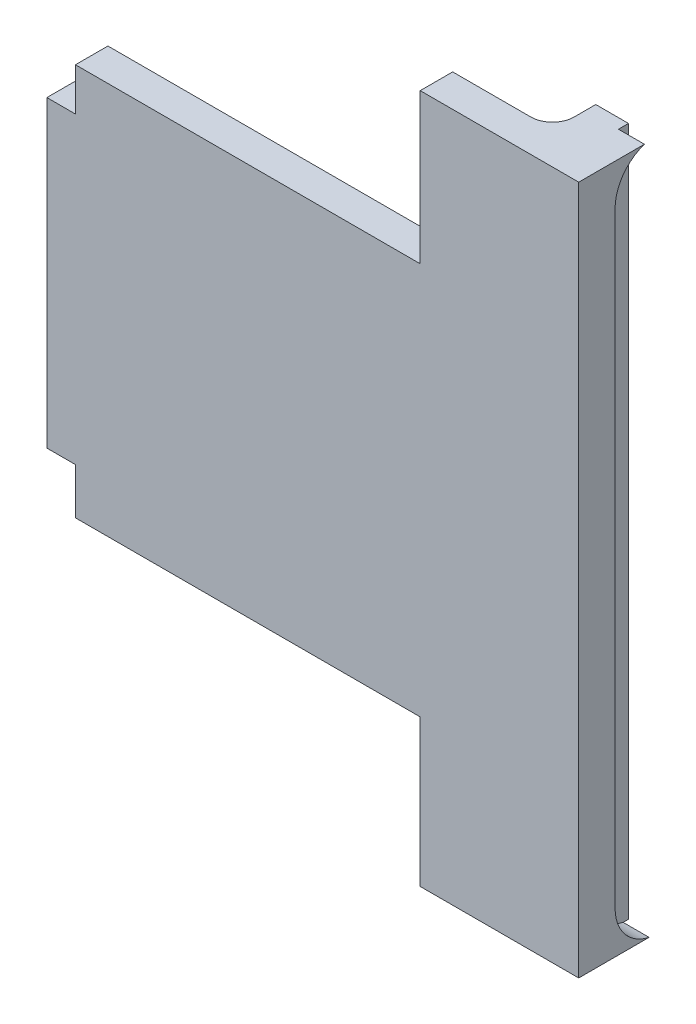
ISO-10303-21;
HEADER;
FILE_DESCRIPTION(('STEP AP214'),'2;1');
FILE_NAME('part.step','',(''),(''),'','','');
FILE_SCHEMA(('AUTOMOTIVE_DESIGN { 1 0 10303 214 1 1 1 1 }'));
ENDSEC;
DATA;
#1=APPLICATION_CONTEXT('core data for automotive mechanical design processes');
#2=APPLICATION_PROTOCOL_DEFINITION('international standard','automotive_design',2000,#1);
#3=PRODUCT_CONTEXT('',#1,'mechanical');
#4=PRODUCT('Part','Part','',(#3));
#5=PRODUCT_RELATED_PRODUCT_CATEGORY('part','',(#4));
#6=PRODUCT_DEFINITION_FORMATION('','',#4);
#7=PRODUCT_DEFINITION_CONTEXT('part definition',#1,'design');
#8=PRODUCT_DEFINITION('design','',#6,#7);
#9=PRODUCT_DEFINITION_SHAPE('','',#8);
#10=(LENGTH_UNIT() NAMED_UNIT(*) SI_UNIT(.MILLI.,.METRE.));
#11=(NAMED_UNIT(*) PLANE_ANGLE_UNIT() SI_UNIT($,.RADIAN.));
#12=(NAMED_UNIT(*) SI_UNIT($,.STERADIAN.) SOLID_ANGLE_UNIT());
#13=UNCERTAINTY_MEASURE_WITH_UNIT(LENGTH_MEASURE(1.E-05),#10,'distance_accuracy_value','');
#14=(GEOMETRIC_REPRESENTATION_CONTEXT(3) GLOBAL_UNCERTAINTY_ASSIGNED_CONTEXT((#13)) GLOBAL_UNIT_ASSIGNED_CONTEXT((#10,
#11,#12)) REPRESENTATION_CONTEXT('',''));
#15=CARTESIAN_POINT('',(0.,0.,0.));
#16=DIRECTION('',(0.,0.,1.));
#17=DIRECTION('',(1.,0.,0.));
#18=AXIS2_PLACEMENT_3D('',#15,#16,#17);
#19=CARTESIAN_POINT('',(0.,0.,-3.5));
#20=DIRECTION('',(0.,0.,-1.));
#21=DIRECTION('',(-1.,0.,0.));
#22=AXIS2_PLACEMENT_3D('',#19,#20,#21);
#23=PLANE('',#22);
#24=DIRECTION('',(1.,0.,0.));
#25=VECTOR('',#24,1.);
#26=CARTESIAN_POINT('',(20.475117675781,24.5546886573642,-3.5));
#27=LINE('',#26,#25);
#28=CARTESIAN_POINT('',(17.7615783203655,24.5546886573642,-3.5));
#29=VERTEX_POINT('',#28);
#30=CARTESIAN_POINT('',(19.275117675781,24.5546886573642,-3.5));
#31=VERTEX_POINT('',#30);
#32=EDGE_CURVE('E273',#29,#31,#27,.T.);
#33=ORIENTED_EDGE('',*,*,#32,.T.);
#34=DIRECTION('',(0.,-1.,0.));
#35=VECTOR('',#34,1.);
#36=CARTESIAN_POINT('',(19.275117675781,0.,-3.5));
#37=LINE('',#36,#35);
#38=CARTESIAN_POINT('',(19.275117675781,-7.29255430174192,-3.5));
#39=VERTEX_POINT('',#38);
#40=EDGE_CURVE('E393',#31,#39,#37,.T.);
#41=ORIENTED_EDGE('',*,*,#40,.T.);
#42=DIRECTION('',(-1.,0.,0.));
#43=VECTOR('',#42,1.);
#44=CARTESIAN_POINT('',(20.475117675781,-7.29255430174192,-3.5));
#45=LINE('',#44,#43);
#46=CARTESIAN_POINT('',(17.7615783203655,-7.29255430174192,-3.5));
#47=VERTEX_POINT('',#46);
#48=EDGE_CURVE('E261',#39,#47,#45,.T.);
#49=ORIENTED_EDGE('',*,*,#48,.T.);
#50=DIRECTION('',(0.,1.,0.));
#51=VECTOR('',#50,1.);
#52=CARTESIAN_POINT('',(17.7615783203655,24.5546886573642,-3.5));
#53=LINE('',#52,#51);
#54=EDGE_CURVE('E271',#47,#29,#53,.T.);
#55=ORIENTED_EDGE('',*,*,#54,.T.);
#56=EDGE_LOOP('',(#33,#41,#49,#55));
#57=FACE_BOUND('',#56,.T.);
#58=ADVANCED_FACE('F39',(#57),#23,.T.);
#59=CARTESIAN_POINT('',(20.475117675781,24.5546886573642,-1.5));
#60=DIRECTION('',(1.,0.,0.));
#61=DIRECTION('',(0.,0.,-1.));
#62=AXIS2_PLACEMENT_3D('',#59,#60,#61);
#63=PLANE('',#62);
#64=CARTESIAN_POINT('',(20.475117675781,22.661301397595,-3.67942817224289));
#65=DIRECTION('',(1.,0.,0.));
#66=DIRECTION('',(0.,0.,-1.));
#67=AXIS2_PLACEMENT_3D('',#64,#65,#66);
#68=CIRCLE('',#67,2.);
#69=CARTESIAN_POINT('',(20.475117675781,24.5546886573642,-3.03515751130633));
#70=VERTEX_POINT('',#69);
#71=CARTESIAN_POINT('',(20.475117675781,22.6613013101723,-1.67942817224289));
#72=VERTEX_POINT('',#71);
#73=EDGE_CURVE('E221',#70,#72,#68,.T.);
#74=ORIENTED_EDGE('',*,*,#73,.F.);
#75=DIRECTION('',(0.,0.,1.));
#76=VECTOR('',#75,1.);
#77=CARTESIAN_POINT('',(20.475117675781,24.5546886573642,-1.5));
#78=LINE('',#77,#76);
#79=CARTESIAN_POINT('',(20.475117675781,24.5546886573642,0.));
#80=VERTEX_POINT('',#79);
#81=EDGE_CURVE('E306',#70,#80,#78,.T.);
#82=ORIENTED_EDGE('',*,*,#81,.T.);
#83=DIRECTION('',(0.,1.,0.));
#84=VECTOR('',#83,1.);
#85=CARTESIAN_POINT('',(20.475117675781,24.5546886573642,0.));
#86=LINE('',#85,#84);
#87=CARTESIAN_POINT('',(20.475117675781,-7.29255430174192,0.));
#88=VERTEX_POINT('',#87);
#89=EDGE_CURVE('E282',#88,#80,#86,.T.);
#90=ORIENTED_EDGE('',*,*,#89,.F.);
#91=DIRECTION('',(0.,0.,1.));
#92=VECTOR('',#91,1.);
#93=CARTESIAN_POINT('',(20.475117675781,-7.29255430174192,-1.5));
#94=LINE('',#93,#92);
#95=CARTESIAN_POINT('',(20.475117675781,-7.29255430174192,-3.25229018446545));
#96=VERTEX_POINT('',#95);
#97=EDGE_CURVE('E341',#96,#88,#94,.T.);
#98=ORIENTED_EDGE('',*,*,#97,.F.);
#99=CARTESIAN_POINT('',(20.475117675781,-5.338698602405,-3.67942939616189));
#100=DIRECTION('',(1.,0.,0.));
#101=DIRECTION('',(0.,0.,-1.));
#102=AXIS2_PLACEMENT_3D('',#99,#100,#101);
#103=CIRCLE('',#102,2.);
#104=CARTESIAN_POINT('',(20.475117675781,-5.3386986898277,-1.6794293961619));
#105=VERTEX_POINT('',#104);
#106=EDGE_CURVE('E215',#105,#96,#103,.T.);
#107=ORIENTED_EDGE('',*,*,#106,.F.);
#108=DIRECTION('',(0.,-0.999999999999999,-4.37113928572386E-08));
#109=VECTOR('',#108,1.);
#110=CARTESIAN_POINT('',(20.475117675781,22.6613013101723,-1.67942817224289));
#111=LINE('',#110,#109);
#112=EDGE_CURVE('E234',#72,#105,#111,.T.);
#113=ORIENTED_EDGE('',*,*,#112,.F.);
#114=EDGE_LOOP('',(#74,#82,#90,#98,#107,#113));
#115=FACE_BOUND('',#114,.T.);
#116=ADVANCED_FACE('F401',(#115),#63,.T.);
#117=CARTESIAN_POINT('',(20.475117675781,-7.29255430174192,-1.5));
#118=DIRECTION('',(0.,-1.,0.));
#119=DIRECTION('',(0.,0.,-1.));
#120=AXIS2_PLACEMENT_3D('',#117,#118,#119);
#121=PLANE('',#120);
#122=DIRECTION('',(1.,0.,0.));
#123=VECTOR('',#122,1.);
#124=CARTESIAN_POINT('',(19.275117675781,-7.29255430174192,-3.25229018446545));
#125=LINE('',#124,#123);
#126=CARTESIAN_POINT('',(19.275117675781,-7.29255430174192,-3.25229018446545));
#127=VERTEX_POINT('',#126);
#128=EDGE_CURVE('E11',#96,#127,#125,.F.);
#129=ORIENTED_EDGE('',*,*,#128,.F.);
#130=ORIENTED_EDGE('',*,*,#97,.T.);
#131=DIRECTION('',(1.,0.,0.));
#132=VECTOR('',#131,1.);
#133=CARTESIAN_POINT('',(20.475117675781,-7.29255430174192,0.));
#134=LINE('',#133,#132);
#135=CARTESIAN_POINT('',(13.1507220749256,-7.29255430174192,0.));
#136=VERTEX_POINT('',#135);
#137=EDGE_CURVE('E286',#136,#88,#134,.T.);
#138=ORIENTED_EDGE('',*,*,#137,.F.);
#139=DIRECTION('',(0.,0.,1.));
#140=VECTOR('',#139,1.);
#141=CARTESIAN_POINT('',(13.1507220749256,-7.29255430174192,-1.5));
#142=LINE('',#141,#140);
#143=CARTESIAN_POINT('',(13.1507220749256,-7.29255430174192,-1.5));
#144=VERTEX_POINT('',#143);
#145=EDGE_CURVE('E344',#144,#136,#142,.T.);
#146=ORIENTED_EDGE('',*,*,#145,.F.);
#147=DIRECTION('',(1.,0.,0.));
#148=VECTOR('',#147,1.);
#149=CARTESIAN_POINT('',(20.475117675781,-7.29255430174192,-1.5));
#150=LINE('',#149,#148);
#151=CARTESIAN_POINT('',(16.7615783203655,-7.29255430174192,-1.5));
#152=VERTEX_POINT('',#151);
#153=EDGE_CURVE('E303',#144,#152,#150,.T.);
#154=ORIENTED_EDGE('',*,*,#153,.T.);
#155=CARTESIAN_POINT('',(16.7615783203655,-7.29255430174192,-2.5));
#156=DIRECTION('',(0.,-1.,0.));
#157=DIRECTION('',(0.,0.,-1.));
#158=AXIS2_PLACEMENT_3D('',#155,#156,#157);
#159=CIRCLE('',#158,1.);
#160=CARTESIAN_POINT('',(17.7615783203655,-7.29255430174192,-2.5));
#161=VERTEX_POINT('',#160);
#162=EDGE_CURVE('E371',#152,#161,#159,.F.);
#163=ORIENTED_EDGE('',*,*,#162,.T.);
#164=DIRECTION('',(0.,0.,1.));
#165=VECTOR('',#164,1.);
#166=CARTESIAN_POINT('',(17.7615783203655,-7.29255430174192,-3.5));
#167=LINE('',#166,#165);
#168=EDGE_CURVE('E279',#47,#161,#167,.T.);
#169=ORIENTED_EDGE('',*,*,#168,.F.);
#170=ORIENTED_EDGE('',*,*,#48,.F.);
#171=DIRECTION('',(0.,0.,1.));
#172=VECTOR('',#171,1.);
#173=CARTESIAN_POINT('',(19.275117675781,-7.29255430174192,-1.5));
#174=LINE('',#173,#172);
#175=EDGE_CURVE('E54',#39,#127,#174,.T.);
#176=ORIENTED_EDGE('',*,*,#175,.T.);
#177=EDGE_LOOP('',(#129,#130,#138,#146,#154,#163,#169,#170,#176));
#178=FACE_BOUND('',#177,.T.);
#179=ADVANCED_FACE('F414',(#178),#121,.T.);
#180=CARTESIAN_POINT('',(13.1507220749256,-0.506964629242378,-1.5));
#181=DIRECTION('',(-1.,0.,0.));
#182=DIRECTION('',(0.,0.,1.));
#183=AXIS2_PLACEMENT_3D('',#180,#181,#182);
#184=PLANE('',#183);
#185=DIRECTION('',(0.,-1.,0.));
#186=VECTOR('',#185,1.);
#187=CARTESIAN_POINT('',(13.1507220749256,-0.506964629242378,0.));
#188=LINE('',#187,#186);
#189=CARTESIAN_POINT('',(13.1507220749256,-0.506964629242378,0.));
#190=VERTEX_POINT('',#189);
#191=EDGE_CURVE('E336',#190,#136,#188,.T.);
#192=ORIENTED_EDGE('',*,*,#191,.F.);
#193=DIRECTION('',(0.,0.,1.));
#194=VECTOR('',#193,1.);
#195=CARTESIAN_POINT('',(13.1507220749256,-0.506964629242378,-1.5));
#196=LINE('',#195,#194);
#197=CARTESIAN_POINT('',(13.1507220749256,-0.506964629242378,-1.5));
#198=VERTEX_POINT('',#197);
#199=EDGE_CURVE('E346',#198,#190,#196,.T.);
#200=ORIENTED_EDGE('',*,*,#199,.F.);
#201=DIRECTION('',(0.,-1.,0.));
#202=VECTOR('',#201,1.);
#203=CARTESIAN_POINT('',(13.1507220749256,-0.506964629242378,-1.5));
#204=LINE('',#203,#202);
#205=EDGE_CURVE('E300',#198,#144,#204,.T.);
#206=ORIENTED_EDGE('',*,*,#205,.T.);
#207=ORIENTED_EDGE('',*,*,#145,.T.);
#208=EDGE_LOOP('',(#192,#200,#206,#207));
#209=FACE_BOUND('',#208,.T.);
#210=ADVANCED_FACE('F453',(#209),#184,.T.);
#211=CARTESIAN_POINT('',(-2.77955076449114,-0.506964629242378,-1.5));
#212=DIRECTION('',(0.,-1.,0.));
#213=DIRECTION('',(0.,0.,-1.));
#214=AXIS2_PLACEMENT_3D('',#211,#212,#213);
#215=PLANE('',#214);
#216=DIRECTION('',(1.,0.,0.));
#217=VECTOR('',#216,1.);
#218=CARTESIAN_POINT('',(-2.77955076449114,-0.506964629242378,0.));
#219=LINE('',#218,#217);
#220=CARTESIAN_POINT('',(-2.77955076449114,-0.506964629242378,0.));
#221=VERTEX_POINT('',#220);
#222=EDGE_CURVE('E333',#221,#190,#219,.T.);
#223=ORIENTED_EDGE('',*,*,#222,.F.);
#224=DIRECTION('',(0.,0.,1.));
#225=VECTOR('',#224,1.);
#226=CARTESIAN_POINT('',(-2.77955076449114,-0.506964629242378,-1.5));
#227=LINE('',#226,#225);
#228=CARTESIAN_POINT('',(-2.77955076449114,-0.506964629242378,-1.5));
#229=VERTEX_POINT('',#228);
#230=EDGE_CURVE('E348',#229,#221,#227,.T.);
#231=ORIENTED_EDGE('',*,*,#230,.F.);
#232=DIRECTION('',(1.,0.,0.));
#233=VECTOR('',#232,1.);
#234=CARTESIAN_POINT('',(-2.77955076449114,-0.506964629242378,-1.5));
#235=LINE('',#234,#233);
#236=EDGE_CURVE('E297',#229,#198,#235,.T.);
#237=ORIENTED_EDGE('',*,*,#236,.T.);
#238=ORIENTED_EDGE('',*,*,#199,.T.);
#239=EDGE_LOOP('',(#223,#231,#237,#238));
#240=FACE_BOUND('',#239,.T.);
#241=ADVANCED_FACE('F456',(#240),#215,.T.);
#242=CARTESIAN_POINT('',(-2.77955076449114,1.62388622505816,-1.5));
#243=DIRECTION('',(-1.,0.,0.));
#244=DIRECTION('',(0.,0.,1.));
#245=AXIS2_PLACEMENT_3D('',#242,#243,#244);
#246=PLANE('',#245);
#247=DIRECTION('',(0.,0.,-1.));
#248=VECTOR('',#247,1.);
#249=CARTESIAN_POINT('',(-2.77955076449114,1.6490004139218,-0.75));
#250=LINE('',#249,#248);
#251=CARTESIAN_POINT('',(-2.77955076449114,1.6490004139218,-0.75));
#252=VERTEX_POINT('',#251);
#253=CARTESIAN_POINT('',(-2.77955076449114,1.6490004139218,-1.2));
#254=VERTEX_POINT('',#253);
#255=EDGE_CURVE('E262',#252,#254,#250,.T.);
#256=ORIENTED_EDGE('',*,*,#255,.T.);
#257=CARTESIAN_POINT('',(-2.77955076449114,1.3490004139218,-1.2));
#258=DIRECTION('',(-1.,0.,0.));
#259=DIRECTION('',(0.,0.,1.));
#260=AXIS2_PLACEMENT_3D('',#257,#258,#259);
#261=CIRCLE('',#260,0.3);
#262=CARTESIAN_POINT('',(-2.77955076449114,1.3490004139218,-1.5));
#263=VERTEX_POINT('',#262);
#264=EDGE_CURVE('E376',#254,#263,#261,.T.);
#265=ORIENTED_EDGE('',*,*,#264,.T.);
#266=DIRECTION('',(0.,-1.,0.));
#267=VECTOR('',#266,1.);
#268=CARTESIAN_POINT('',(-2.77955076449114,1.62388622505816,-1.5));
#269=LINE('',#268,#267);
#270=EDGE_CURVE('E295',#263,#229,#269,.T.);
#271=ORIENTED_EDGE('',*,*,#270,.T.);
#272=ORIENTED_EDGE('',*,*,#230,.T.);
#273=DIRECTION('',(0.,-1.,0.));
#274=VECTOR('',#273,1.);
#275=CARTESIAN_POINT('',(-2.77955076449114,1.62388622505816,0.));
#276=LINE('',#275,#274);
#277=CARTESIAN_POINT('',(-2.77955076449114,1.62388622505816,0.));
#278=VERTEX_POINT('',#277);
#279=EDGE_CURVE('E330',#278,#221,#276,.T.);
#280=ORIENTED_EDGE('',*,*,#279,.F.);
#281=DIRECTION('',(0.,0.,1.));
#282=VECTOR('',#281,1.);
#283=CARTESIAN_POINT('',(-2.77955076449114,1.62388622505816,-1.5));
#284=LINE('',#283,#282);
#285=CARTESIAN_POINT('',(-2.77955076449114,1.62388622505816,-0.75));
#286=VERTEX_POINT('',#285);
#287=EDGE_CURVE('E350',#286,#278,#284,.T.);
#288=ORIENTED_EDGE('',*,*,#287,.F.);
#289=DIRECTION('',(0.,-1.,0.));
#290=VECTOR('',#289,1.);
#291=CARTESIAN_POINT('',(-2.77955076449114,1.6490004139218,-0.75));
#292=LINE('',#291,#290);
#293=EDGE_CURVE('E250',#252,#286,#292,.T.);
#294=ORIENTED_EDGE('',*,*,#293,.F.);
#295=EDGE_LOOP('',(#256,#265,#271,#272,#280,#288,#294));
#296=FACE_BOUND('',#295,.T.);
#297=ADVANCED_FACE('F460',(#296),#246,.T.);
#298=CARTESIAN_POINT('',(-4.099999879847,1.62388622505816,-1.5));
#299=DIRECTION('',(0.,-1.,0.));
#300=DIRECTION('',(0.,0.,-1.));
#301=AXIS2_PLACEMENT_3D('',#298,#299,#300);
#302=PLANE('',#301);
#303=DIRECTION('',(-1.,0.,0.));
#304=VECTOR('',#303,1.);
#305=CARTESIAN_POINT('',(-2.77955076449114,1.62388622505816,-0.75));
#306=LINE('',#305,#304);
#307=CARTESIAN_POINT('',(-4.099999879847,1.62388622505816,-0.75));
#308=VERTEX_POINT('',#307);
#309=EDGE_CURVE('E252',#286,#308,#306,.T.);
#310=ORIENTED_EDGE('',*,*,#309,.F.);
#311=ORIENTED_EDGE('',*,*,#287,.T.);
#312=DIRECTION('',(1.,0.,0.));
#313=VECTOR('',#312,1.);
#314=CARTESIAN_POINT('',(-4.099999879847,1.62388622505816,0.));
#315=LINE('',#314,#313);
#316=CARTESIAN_POINT('',(-4.099999879847,1.62388622505816,0.));
#317=VERTEX_POINT('',#316);
#318=EDGE_CURVE('E327',#317,#278,#315,.T.);
#319=ORIENTED_EDGE('',*,*,#318,.F.);
#320=DIRECTION('',(0.,0.,1.));
#321=VECTOR('',#320,1.);
#322=CARTESIAN_POINT('',(-4.099999879847,1.62388622505816,-1.5));
#323=LINE('',#322,#321);
#324=EDGE_CURVE('E352',#308,#317,#323,.T.);
#325=ORIENTED_EDGE('',*,*,#324,.F.);
#326=EDGE_LOOP('',(#310,#311,#319,#325));
#327=FACE_BOUND('',#326,.T.);
#328=ADVANCED_FACE('F464',(#327),#302,.T.);
#329=CARTESIAN_POINT('',(-4.099999879847,15.6524412766217,-1.5));
#330=DIRECTION('',(-1.,0.,0.));
#331=DIRECTION('',(0.,0.,1.));
#332=AXIS2_PLACEMENT_3D('',#329,#330,#331);
#333=PLANE('',#332);
#334=DIRECTION('',(0.,0.,1.));
#335=VECTOR('',#334,1.);
#336=CARTESIAN_POINT('',(-4.099999879847,15.6524412766217,-1.5));
#337=LINE('',#336,#335);
#338=CARTESIAN_POINT('',(-4.099999879847,15.6524412766217,-1.38424038396934));
#339=VERTEX_POINT('',#338);
#340=CARTESIAN_POINT('',(-4.099999879847,15.6524412766217,0.));
#341=VERTEX_POINT('',#340);
#342=EDGE_CURVE('E354',#339,#341,#337,.T.);
#343=ORIENTED_EDGE('',*,*,#342,.F.);
#344=CARTESIAN_POINT('',(-4.099999879847,15.8892016637536,-1.2));
#345=DIRECTION('',(-1.,0.,0.));
#346=DIRECTION('',(0.,0.,1.));
#347=AXIS2_PLACEMENT_3D('',#344,#345,#346);
#348=CIRCLE('',#347,0.3);
#349=CARTESIAN_POINT('',(-4.099999879847,15.5892016637535,-1.2));
#350=VERTEX_POINT('',#349);
#351=EDGE_CURVE('E391',#339,#350,#348,.T.);
#352=ORIENTED_EDGE('',*,*,#351,.T.);
#353=DIRECTION('',(0.,0.,-1.));
#354=VECTOR('',#353,1.);
#355=CARTESIAN_POINT('',(-4.099999879847,15.5892016637535,-0.75));
#356=LINE('',#355,#354);
#357=CARTESIAN_POINT('',(-4.099999879847,15.5892016637535,-0.75));
#358=VERTEX_POINT('',#357);
#359=EDGE_CURVE('E258',#358,#350,#356,.T.);
#360=ORIENTED_EDGE('',*,*,#359,.F.);
#361=DIRECTION('',(0.,1.,0.));
#362=VECTOR('',#361,1.);
#363=CARTESIAN_POINT('',(-4.099999879847,15.5892016637535,-0.75));
#364=LINE('',#363,#362);
#365=EDGE_CURVE('E254',#308,#358,#364,.T.);
#366=ORIENTED_EDGE('',*,*,#365,.F.);
#367=ORIENTED_EDGE('',*,*,#324,.T.);
#368=DIRECTION('',(0.,-1.,0.));
#369=VECTOR('',#368,1.);
#370=CARTESIAN_POINT('',(-4.099999879847,15.6524412766217,0.));
#371=LINE('',#370,#369);
#372=EDGE_CURVE('E324',#341,#317,#371,.T.);
#373=ORIENTED_EDGE('',*,*,#372,.F.);
#374=EDGE_LOOP('',(#343,#352,#360,#366,#367,#373));
#375=FACE_BOUND('',#374,.T.);
#376=ADVANCED_FACE('F468',(#375),#333,.T.);
#377=CARTESIAN_POINT('',(-4.099999879847,15.6524412766217,-1.5));
#378=DIRECTION('',(0.,1.,0.));
#379=DIRECTION('',(0.,0.,1.));
#380=AXIS2_PLACEMENT_3D('',#377,#378,#379);
#381=PLANE('',#380);
#382=DIRECTION('',(0.,0.,1.));
#383=VECTOR('',#382,1.);
#384=CARTESIAN_POINT('',(-2.77955076449114,15.6524412766217,-1.5));
#385=LINE('',#384,#383);
#386=CARTESIAN_POINT('',(-2.77955076449114,15.6524412766217,-1.38424038396934));
#387=VERTEX_POINT('',#386);
#388=CARTESIAN_POINT('',(-2.77955076449114,15.6524412766217,0.));
#389=VERTEX_POINT('',#388);
#390=EDGE_CURVE('E356',#387,#389,#385,.T.);
#391=ORIENTED_EDGE('',*,*,#390,.F.);
#392=DIRECTION('',(-1.,0.,0.));
#393=VECTOR('',#392,1.);
#394=CARTESIAN_POINT('',(-2.77955076449114,15.6524412766217,-1.38424038396934));
#395=LINE('',#394,#393);
#396=EDGE_CURVE('E62',#387,#339,#395,.T.);
#397=ORIENTED_EDGE('',*,*,#396,.T.);
#398=ORIENTED_EDGE('',*,*,#342,.T.);
#399=DIRECTION('',(-1.,0.,0.));
#400=VECTOR('',#399,1.);
#401=CARTESIAN_POINT('',(-4.099999879847,15.6524412766217,0.));
#402=LINE('',#401,#400);
#403=EDGE_CURVE('E321',#389,#341,#402,.T.);
#404=ORIENTED_EDGE('',*,*,#403,.F.);
#405=EDGE_LOOP('',(#391,#397,#398,#404));
#406=FACE_BOUND('',#405,.T.);
#407=ADVANCED_FACE('F472',(#406),#381,.T.);
#408=CARTESIAN_POINT('',(-2.77955076449114,17.6256404526431,-1.5));
#409=DIRECTION('',(-1.,0.,0.));
#410=DIRECTION('',(0.,0.,1.));
#411=AXIS2_PLACEMENT_3D('',#408,#409,#410);
#412=PLANE('',#411);
#413=DIRECTION('',(0.,-1.,0.));
#414=VECTOR('',#413,1.);
#415=CARTESIAN_POINT('',(-2.77955076449114,17.6256404526431,-1.5));
#416=LINE('',#415,#414);
#417=CARTESIAN_POINT('',(-2.77955076449114,17.6256404526431,-1.5));
#418=VERTEX_POINT('',#417);
#419=CARTESIAN_POINT('',(-2.77955076449114,15.8892016637536,-1.5));
#420=VERTEX_POINT('',#419);
#421=EDGE_CURVE('E292',#418,#420,#416,.T.);
#422=ORIENTED_EDGE('',*,*,#421,.T.);
#423=CARTESIAN_POINT('',(-2.77955076449114,15.8892016637536,-1.2));
#424=DIRECTION('',(-1.,0.,0.));
#425=DIRECTION('',(0.,0.,1.));
#426=AXIS2_PLACEMENT_3D('',#423,#424,#425);
#427=CIRCLE('',#426,0.3);
#428=EDGE_CURVE('E388',#420,#387,#427,.T.);
#429=ORIENTED_EDGE('',*,*,#428,.T.);
#430=ORIENTED_EDGE('',*,*,#390,.T.);
#431=DIRECTION('',(0.,-1.,0.));
#432=VECTOR('',#431,1.);
#433=CARTESIAN_POINT('',(-2.77955076449114,17.6256404526431,0.));
#434=LINE('',#433,#432);
#435=CARTESIAN_POINT('',(-2.77955076449114,17.6256404526431,0.));
#436=VERTEX_POINT('',#435);
#437=EDGE_CURVE('E318',#436,#389,#434,.T.);
#438=ORIENTED_EDGE('',*,*,#437,.F.);
#439=DIRECTION('',(0.,0.,1.));
#440=VECTOR('',#439,1.);
#441=CARTESIAN_POINT('',(-2.77955076449114,17.6256404526431,-1.5));
#442=LINE('',#441,#440);
#443=EDGE_CURVE('E358',#418,#436,#442,.T.);
#444=ORIENTED_EDGE('',*,*,#443,.F.);
#445=EDGE_LOOP('',(#422,#429,#430,#438,#444));
#446=FACE_BOUND('',#445,.T.);
#447=ADVANCED_FACE('F476',(#446),#412,.T.);
#448=CARTESIAN_POINT('',(-2.77955076449114,17.6256404526431,-1.5));
#449=DIRECTION('',(0.,1.,0.));
#450=DIRECTION('',(0.,0.,1.));
#451=AXIS2_PLACEMENT_3D('',#448,#449,#450);
#452=PLANE('',#451);
#453=DIRECTION('',(-1.,0.,0.));
#454=VECTOR('',#453,1.);
#455=CARTESIAN_POINT('',(-2.77955076449114,17.6256404526431,0.));
#456=LINE('',#455,#454);
#457=CARTESIAN_POINT('',(13.1507220749256,17.6256404526431,0.));
#458=VERTEX_POINT('',#457);
#459=EDGE_CURVE('E315',#458,#436,#456,.T.);
#460=ORIENTED_EDGE('',*,*,#459,.F.);
#461=DIRECTION('',(0.,0.,1.));
#462=VECTOR('',#461,1.);
#463=CARTESIAN_POINT('',(13.1507220749256,17.6256404526431,-1.5));
#464=LINE('',#463,#462);
#465=CARTESIAN_POINT('',(13.1507220749256,17.6256404526431,-1.5));
#466=VERTEX_POINT('',#465);
#467=EDGE_CURVE('E360',#466,#458,#464,.T.);
#468=ORIENTED_EDGE('',*,*,#467,.F.);
#469=DIRECTION('',(-1.,0.,0.));
#470=VECTOR('',#469,1.);
#471=CARTESIAN_POINT('',(-2.77955076449114,17.6256404526431,-1.5));
#472=LINE('',#471,#470);
#473=EDGE_CURVE('E289',#466,#418,#472,.T.);
#474=ORIENTED_EDGE('',*,*,#473,.T.);
#475=ORIENTED_EDGE('',*,*,#443,.T.);
#476=EDGE_LOOP('',(#460,#468,#474,#475));
#477=FACE_BOUND('',#476,.T.);
#478=ADVANCED_FACE('F479',(#477),#452,.T.);
#479=CARTESIAN_POINT('',(13.1507220749256,24.5546886573642,-1.5));
#480=DIRECTION('',(-1.,0.,0.));
#481=DIRECTION('',(0.,0.,1.));
#482=AXIS2_PLACEMENT_3D('',#479,#480,#481);
#483=PLANE('',#482);
#484=DIRECTION('',(0.,-1.,0.));
#485=VECTOR('',#484,1.);
#486=CARTESIAN_POINT('',(13.1507220749256,24.5546886573642,0.));
#487=LINE('',#486,#485);
#488=CARTESIAN_POINT('',(13.1507220749256,24.5546886573642,0.));
#489=VERTEX_POINT('',#488);
#490=EDGE_CURVE('E312',#489,#458,#487,.T.);
#491=ORIENTED_EDGE('',*,*,#490,.F.);
#492=DIRECTION('',(0.,0.,1.));
#493=VECTOR('',#492,1.);
#494=CARTESIAN_POINT('',(13.1507220749256,24.5546886573642,-1.5));
#495=LINE('',#494,#493);
#496=CARTESIAN_POINT('',(13.1507220749256,24.5546886573642,-1.5));
#497=VERTEX_POINT('',#496);
#498=EDGE_CURVE('E362',#497,#489,#495,.T.);
#499=ORIENTED_EDGE('',*,*,#498,.F.);
#500=DIRECTION('',(0.,-1.,0.));
#501=VECTOR('',#500,1.);
#502=CARTESIAN_POINT('',(13.1507220749256,24.5546886573642,-1.5));
#503=LINE('',#502,#501);
#504=EDGE_CURVE('E285',#497,#466,#503,.T.);
#505=ORIENTED_EDGE('',*,*,#504,.T.);
#506=ORIENTED_EDGE('',*,*,#467,.T.);
#507=EDGE_LOOP('',(#491,#499,#505,#506));
#508=FACE_BOUND('',#507,.T.);
#509=ADVANCED_FACE('F483',(#508),#483,.T.);
#510=CARTESIAN_POINT('',(20.475117675781,24.5546886573642,-1.5));
#511=DIRECTION('',(0.,1.,0.));
#512=DIRECTION('',(0.,0.,1.));
#513=AXIS2_PLACEMENT_3D('',#510,#511,#512);
#514=PLANE('',#513);
#515=DIRECTION('',(1.,0.,0.));
#516=VECTOR('',#515,1.);
#517=CARTESIAN_POINT('',(19.275117675781,24.5546886573642,-3.03515751130633));
#518=LINE('',#517,#516);
#519=CARTESIAN_POINT('',(19.275117675781,24.5546886573642,-3.03515751130633));
#520=VERTEX_POINT('',#519);
#521=EDGE_CURVE('E47',#520,#70,#518,.T.);
#522=ORIENTED_EDGE('',*,*,#521,.F.);
#523=DIRECTION('',(0.,0.,-1.));
#524=VECTOR('',#523,1.);
#525=CARTESIAN_POINT('',(19.275117675781,24.5546886573642,-1.5));
#526=LINE('',#525,#524);
#527=EDGE_CURVE('E212',#520,#31,#526,.T.);
#528=ORIENTED_EDGE('',*,*,#527,.T.);
#529=ORIENTED_EDGE('',*,*,#32,.F.);
#530=DIRECTION('',(0.,0.,1.));
#531=VECTOR('',#530,1.);
#532=CARTESIAN_POINT('',(17.7615783203655,24.5546886573642,-3.5));
#533=LINE('',#532,#531);
#534=CARTESIAN_POINT('',(17.7615783203655,24.5546886573642,-2.5));
#535=VERTEX_POINT('',#534);
#536=EDGE_CURVE('E276',#29,#535,#533,.T.);
#537=ORIENTED_EDGE('',*,*,#536,.T.);
#538=CARTESIAN_POINT('',(16.7615783203655,24.5546886573642,-2.5));
#539=DIRECTION('',(0.,1.,0.));
#540=DIRECTION('',(0.,0.,1.));
#541=AXIS2_PLACEMENT_3D('',#538,#539,#540);
#542=CIRCLE('',#541,1.);
#543=CARTESIAN_POINT('',(16.7615783203655,24.5546886573642,-1.5));
#544=VERTEX_POINT('',#543);
#545=EDGE_CURVE('E369',#535,#544,#542,.F.);
#546=ORIENTED_EDGE('',*,*,#545,.T.);
#547=DIRECTION('',(-1.,0.,0.));
#548=VECTOR('',#547,1.);
#549=CARTESIAN_POINT('',(20.475117675781,24.5546886573642,-1.5));
#550=LINE('',#549,#548);
#551=EDGE_CURVE('E283',#544,#497,#550,.T.);
#552=ORIENTED_EDGE('',*,*,#551,.T.);
#553=ORIENTED_EDGE('',*,*,#498,.T.);
#554=DIRECTION('',(-1.,0.,0.));
#555=VECTOR('',#554,1.);
#556=CARTESIAN_POINT('',(20.475117675781,24.5546886573642,0.));
#557=LINE('',#556,#555);
#558=EDGE_CURVE('E309',#80,#489,#557,.T.);
#559=ORIENTED_EDGE('',*,*,#558,.F.);
#560=ORIENTED_EDGE('',*,*,#81,.F.);
#561=EDGE_LOOP('',(#522,#528,#529,#537,#546,#552,#553,#559,#560));
#562=FACE_BOUND('',#561,.T.);
#563=ADVANCED_FACE('F405',(#562),#514,.T.);
#564=CARTESIAN_POINT('',(0.,0.,-1.5));
#565=DIRECTION('',(0.,0.,-1.));
#566=DIRECTION('',(-1.,0.,0.));
#567=AXIS2_PLACEMENT_3D('',#564,#565,#566);
#568=PLANE('',#567);
#569=ORIENTED_EDGE('',*,*,#270,.F.);
#570=DIRECTION('',(-1.,0.,0.));
#571=VECTOR('',#570,1.);
#572=CARTESIAN_POINT('',(9.46664116922591,1.3490004139218,-1.5));
#573=LINE('',#572,#571);
#574=CARTESIAN_POINT('',(9.76664116922591,1.3490004139218,-1.5));
#575=VERTEX_POINT('',#574);
#576=EDGE_CURVE('E382',#263,#575,#573,.F.);
#577=ORIENTED_EDGE('',*,*,#576,.T.);
#578=DIRECTION('',(0.,-1.,0.));
#579=VECTOR('',#578,1.);
#580=CARTESIAN_POINT('',(9.76664116922591,15.5892016637535,-1.5));
#581=LINE('',#580,#579);
#582=CARTESIAN_POINT('',(9.76664116922591,15.8892016637536,-1.5));
#583=VERTEX_POINT('',#582);
#584=EDGE_CURVE('E380',#575,#583,#581,.F.);
#585=ORIENTED_EDGE('',*,*,#584,.T.);
#586=DIRECTION('',(1.,0.,0.));
#587=VECTOR('',#586,1.);
#588=CARTESIAN_POINT('',(-4.099999879847,15.8892016637536,-1.5));
#589=LINE('',#588,#587);
#590=EDGE_CURVE('E378',#583,#420,#589,.F.);
#591=ORIENTED_EDGE('',*,*,#590,.T.);
#592=ORIENTED_EDGE('',*,*,#421,.F.);
#593=ORIENTED_EDGE('',*,*,#473,.F.);
#594=ORIENTED_EDGE('',*,*,#504,.F.);
#595=ORIENTED_EDGE('',*,*,#551,.F.);
#596=DIRECTION('',(0.,1.,0.));
#597=VECTOR('',#596,1.);
#598=CARTESIAN_POINT('',(16.7615783203655,0.,-1.5));
#599=LINE('',#598,#597);
#600=EDGE_CURVE('E367',#544,#152,#599,.F.);
#601=ORIENTED_EDGE('',*,*,#600,.T.);
#602=ORIENTED_EDGE('',*,*,#153,.F.);
#603=ORIENTED_EDGE('',*,*,#205,.F.);
#604=ORIENTED_EDGE('',*,*,#236,.F.);
#605=EDGE_LOOP('',(#569,#577,#585,#591,#592,#593,#594,#595,#601,#602,#603,#604));
#606=FACE_BOUND('',#605,.T.);
#607=ADVANCED_FACE('F445',(#606),#568,.T.);
#608=CARTESIAN_POINT('',(0.,0.,0.));
#609=DIRECTION('',(0.,0.,-1.));
#610=DIRECTION('',(-1.,0.,0.));
#611=AXIS2_PLACEMENT_3D('',#608,#609,#610);
#612=PLANE('',#611);
#613=ORIENTED_EDGE('',*,*,#89,.T.);
#614=ORIENTED_EDGE('',*,*,#558,.T.);
#615=ORIENTED_EDGE('',*,*,#490,.T.);
#616=ORIENTED_EDGE('',*,*,#459,.T.);
#617=ORIENTED_EDGE('',*,*,#437,.T.);
#618=ORIENTED_EDGE('',*,*,#403,.T.);
#619=ORIENTED_EDGE('',*,*,#372,.T.);
#620=ORIENTED_EDGE('',*,*,#318,.T.);
#621=ORIENTED_EDGE('',*,*,#279,.T.);
#622=ORIENTED_EDGE('',*,*,#222,.T.);
#623=ORIENTED_EDGE('',*,*,#191,.T.);
#624=ORIENTED_EDGE('',*,*,#137,.T.);
#625=EDGE_LOOP('',(#613,#614,#615,#616,#617,#618,#619,#620,#621,#622,#623,#624));
#626=FACE_BOUND('',#625,.T.);
#627=ADVANCED_FACE('F409',(#626),#612,.F.);
#628=CARTESIAN_POINT('',(17.7615783203655,24.5546886573642,-3.5));
#629=DIRECTION('',(1.,0.,0.));
#630=DIRECTION('',(0.,0.,-1.));
#631=AXIS2_PLACEMENT_3D('',#628,#629,#630);
#632=PLANE('',#631);
#633=ORIENTED_EDGE('',*,*,#168,.T.);
#634=DIRECTION('',(0.,1.,0.));
#635=VECTOR('',#634,1.);
#636=CARTESIAN_POINT('',(17.7615783203655,24.5546886573642,-2.5));
#637=LINE('',#636,#635);
#638=EDGE_CURVE('E343',#161,#535,#637,.T.);
#639=ORIENTED_EDGE('',*,*,#638,.T.);
#640=ORIENTED_EDGE('',*,*,#536,.F.);
#641=ORIENTED_EDGE('',*,*,#54,.F.);
#642=EDGE_LOOP('',(#633,#639,#640,#641));
#643=FACE_BOUND('',#642,.T.);
#644=ADVANCED_FACE('F440',(#643),#632,.F.);
#645=CARTESIAN_POINT('',(-2.77955076449114,1.6490004139218,-0.75));
#646=DIRECTION('',(0.,-1.,0.));
#647=DIRECTION('',(0.,0.,-1.));
#648=AXIS2_PLACEMENT_3D('',#645,#646,#647);
#649=PLANE('',#648);
#650=DIRECTION('',(0.,0.,-1.));
#651=VECTOR('',#650,1.);
#652=CARTESIAN_POINT('',(9.46664116922591,1.6490004139218,-0.75));
#653=LINE('',#652,#651);
#654=CARTESIAN_POINT('',(9.46664116922591,1.6490004139218,-0.75));
#655=VERTEX_POINT('',#654);
#656=CARTESIAN_POINT('',(9.46664116922591,1.6490004139218,-1.2));
#657=VERTEX_POINT('',#656);
#658=EDGE_CURVE('E265',#655,#657,#653,.T.);
#659=ORIENTED_EDGE('',*,*,#658,.T.);
#660=DIRECTION('',(-1.,0.,0.));
#661=VECTOR('',#660,1.);
#662=CARTESIAN_POINT('',(-2.77955076449114,1.6490004139218,-1.2));
#663=LINE('',#662,#661);
#664=EDGE_CURVE('E373',#657,#254,#663,.T.);
#665=ORIENTED_EDGE('',*,*,#664,.T.);
#666=ORIENTED_EDGE('',*,*,#255,.F.);
#667=DIRECTION('',(-1.,0.,0.));
#668=VECTOR('',#667,1.);
#669=CARTESIAN_POINT('',(-2.77955076449114,1.6490004139218,-0.75));
#670=LINE('',#669,#668);
#671=EDGE_CURVE('E247',#655,#252,#670,.T.);
#672=ORIENTED_EDGE('',*,*,#671,.F.);
#673=EDGE_LOOP('',(#659,#665,#666,#672));
#674=FACE_BOUND('',#673,.T.);
#675=ADVANCED_FACE('F443',(#674),#649,.F.);
#676=CARTESIAN_POINT('',(9.46664116922591,15.5892016637535,-0.75));
#677=DIRECTION('',(1.,0.,0.));
#678=DIRECTION('',(0.,0.,-1.));
#679=AXIS2_PLACEMENT_3D('',#676,#677,#678);
#680=PLANE('',#679);
#681=DIRECTION('',(0.,0.,-1.));
#682=VECTOR('',#681,1.);
#683=CARTESIAN_POINT('',(9.46664116922591,15.5892016637535,-0.75));
#684=LINE('',#683,#682);
#685=CARTESIAN_POINT('',(9.46664116922591,15.5892016637535,-0.75));
#686=VERTEX_POINT('',#685);
#687=CARTESIAN_POINT('',(9.46664116922591,15.5892016637535,-1.2));
#688=VERTEX_POINT('',#687);
#689=EDGE_CURVE('E257',#686,#688,#684,.T.);
#690=ORIENTED_EDGE('',*,*,#689,.T.);
#691=DIRECTION('',(0.,-1.,0.));
#692=VECTOR('',#691,1.);
#693=CARTESIAN_POINT('',(9.46664116922591,1.6490004139218,-1.2));
#694=LINE('',#693,#692);
#695=EDGE_CURVE('E384',#688,#657,#694,.T.);
#696=ORIENTED_EDGE('',*,*,#695,.T.);
#697=ORIENTED_EDGE('',*,*,#658,.F.);
#698=DIRECTION('',(0.,-1.,0.));
#699=VECTOR('',#698,1.);
#700=CARTESIAN_POINT('',(9.46664116922591,15.5892016637535,-0.75));
#701=LINE('',#700,#699);
#702=EDGE_CURVE('E243',#686,#655,#701,.T.);
#703=ORIENTED_EDGE('',*,*,#702,.F.);
#704=EDGE_LOOP('',(#690,#696,#697,#703));
#705=FACE_BOUND('',#704,.T.);
#706=ADVANCED_FACE('F549',(#705),#680,.F.);
#707=CARTESIAN_POINT('',(-2.77955076449114,15.5892016637535,-0.75));
#708=DIRECTION('',(0.,1.,0.));
#709=DIRECTION('',(0.,0.,1.));
#710=AXIS2_PLACEMENT_3D('',#707,#708,#709);
#711=PLANE('',#710);
#712=ORIENTED_EDGE('',*,*,#359,.T.);
#713=DIRECTION('',(1.,0.,0.));
#714=VECTOR('',#713,1.);
#715=CARTESIAN_POINT('',(9.46664116922591,15.5892016637535,-1.2));
#716=LINE('',#715,#714);
#717=EDGE_CURVE('E386',#350,#688,#716,.T.);
#718=ORIENTED_EDGE('',*,*,#717,.T.);
#719=ORIENTED_EDGE('',*,*,#689,.F.);
#720=DIRECTION('',(1.,0.,0.));
#721=VECTOR('',#720,1.);
#722=CARTESIAN_POINT('',(-2.77955076449114,15.5892016637535,-0.75));
#723=LINE('',#722,#721);
#724=EDGE_CURVE('E241',#358,#686,#723,.T.);
#725=ORIENTED_EDGE('',*,*,#724,.F.);
#726=EDGE_LOOP('',(#712,#718,#719,#725));
#727=FACE_BOUND('',#726,.T.);
#728=ADVANCED_FACE('F438',(#727),#711,.F.);
#729=CARTESIAN_POINT('',(0.,0.,-0.75));
#730=DIRECTION('',(0.,0.,1.));
#731=DIRECTION('',(1.,0.,0.));
#732=AXIS2_PLACEMENT_3D('',#729,#730,#731);
#733=PLANE('',#732);
#734=ORIENTED_EDGE('',*,*,#724,.T.);
#735=ORIENTED_EDGE('',*,*,#702,.T.);
#736=ORIENTED_EDGE('',*,*,#671,.T.);
#737=ORIENTED_EDGE('',*,*,#293,.T.);
#738=ORIENTED_EDGE('',*,*,#309,.T.);
#739=ORIENTED_EDGE('',*,*,#365,.T.);
#740=EDGE_LOOP('',(#734,#735,#736,#737,#738,#739));
#741=FACE_BOUND('',#740,.T.);
#742=ADVANCED_FACE('F493',(#741),#733,.F.);
#743=CARTESIAN_POINT('',(16.7615783203655,24.5546886573642,-2.5));
#744=DIRECTION('',(0.,1.,0.));
#745=DIRECTION('',(0.,0.,1.));
#746=AXIS2_PLACEMENT_3D('',#743,#744,#745);
#747=CYLINDRICAL_SURFACE('',#746,1.);
#748=ORIENTED_EDGE('',*,*,#162,.F.);
#749=ORIENTED_EDGE('',*,*,#600,.F.);
#750=ORIENTED_EDGE('',*,*,#545,.F.);
#751=ORIENTED_EDGE('',*,*,#638,.F.);
#752=EDGE_LOOP('',(#748,#749,#750,#751));
#753=FACE_BOUND('',#752,.T.);
#754=ADVANCED_FACE('F490',(#753),#747,.F.);
#755=CARTESIAN_POINT('',(-2.77955076449114,15.8892016637536,-1.2));
#756=DIRECTION('',(-1.,0.,0.));
#757=DIRECTION('',(0.,0.,1.));
#758=AXIS2_PLACEMENT_3D('',#755,#756,#757);
#759=CYLINDRICAL_SURFACE('',#758,0.3);
#760=ORIENTED_EDGE('',*,*,#428,.F.);
#761=ORIENTED_EDGE('',*,*,#590,.F.);
#762=CARTESIAN_POINT('',(9.76664116922591,15.8892016637536,-1.2));
#763=DIRECTION('',(-0.707106781186547,0.707106781186547,0.));
#764=DIRECTION('',(0.707106781186547,0.707106781186547,0.));
#765=AXIS2_PLACEMENT_3D('',#762,#763,#764);
#766=ELLIPSE('',#765,0.424264068711928,0.3);
#767=EDGE_CURVE('E244',#688,#583,#766,.F.);
#768=ORIENTED_EDGE('',*,*,#767,.F.);
#769=ORIENTED_EDGE('',*,*,#717,.F.);
#770=ORIENTED_EDGE('',*,*,#351,.F.);
#771=ORIENTED_EDGE('',*,*,#396,.F.);
#772=EDGE_LOOP('',(#760,#761,#768,#769,#770,#771));
#773=FACE_BOUND('',#772,.T.);
#774=ADVANCED_FACE('F41',(#773),#759,.T.);
#775=CARTESIAN_POINT('',(9.76664116922591,15.5892016637535,-1.2));
#776=DIRECTION('',(0.,1.,0.));
#777=DIRECTION('',(0.,0.,1.));
#778=AXIS2_PLACEMENT_3D('',#775,#776,#777);
#779=CYLINDRICAL_SURFACE('',#778,0.3);
#780=ORIENTED_EDGE('',*,*,#767,.T.);
#781=ORIENTED_EDGE('',*,*,#584,.F.);
#782=CARTESIAN_POINT('',(9.76664116922591,1.3490004139218,-1.2));
#783=DIRECTION('',(0.707106781186547,0.707106781186547,0.));
#784=DIRECTION('',(0.707106781186547,-0.707106781186547,0.));
#785=AXIS2_PLACEMENT_3D('',#782,#783,#784);
#786=ELLIPSE('',#785,0.424264068711928,0.3);
#787=EDGE_CURVE('E240',#657,#575,#786,.F.);
#788=ORIENTED_EDGE('',*,*,#787,.F.);
#789=ORIENTED_EDGE('',*,*,#695,.F.);
#790=EDGE_LOOP('',(#780,#781,#788,#789));
#791=FACE_BOUND('',#790,.T.);
#792=ADVANCED_FACE('F495',(#791),#779,.T.);
#793=CARTESIAN_POINT('',(-2.77955076449114,1.3490004139218,-1.2));
#794=DIRECTION('',(1.,0.,0.));
#795=DIRECTION('',(0.,0.,-1.));
#796=AXIS2_PLACEMENT_3D('',#793,#794,#795);
#797=CYLINDRICAL_SURFACE('',#796,0.3);
#798=ORIENTED_EDGE('',*,*,#787,.T.);
#799=ORIENTED_EDGE('',*,*,#576,.F.);
#800=ORIENTED_EDGE('',*,*,#264,.F.);
#801=ORIENTED_EDGE('',*,*,#664,.F.);
#802=EDGE_LOOP('',(#798,#799,#800,#801));
#803=FACE_BOUND('',#802,.T.);
#804=ADVANCED_FACE('F425',(#803),#797,.T.);
#805=CARTESIAN_POINT('',(19.275117675781,22.661301397595,-3.67942817224289));
#806=DIRECTION('',(1.,0.,0.));
#807=DIRECTION('',(0.,0.,-1.));
#808=AXIS2_PLACEMENT_3D('',#805,#806,#807);
#809=CYLINDRICAL_SURFACE('',#808,2.);
#810=ORIENTED_EDGE('',*,*,#521,.T.);
#811=ORIENTED_EDGE('',*,*,#73,.T.);
#812=DIRECTION('',(1.,0.,0.));
#813=VECTOR('',#812,1.);
#814=CARTESIAN_POINT('',(19.275117675781,22.6613013101723,-1.67942817224289));
#815=LINE('',#814,#813);
#816=CARTESIAN_POINT('',(19.275117675781,22.6613013101723,-1.67942817224289));
#817=VERTEX_POINT('',#816);
#818=EDGE_CURVE('E218',#817,#72,#815,.T.);
#819=ORIENTED_EDGE('',*,*,#818,.F.);
#820=CARTESIAN_POINT('',(19.275117675781,22.661301397595,-3.67942817224289));
#821=DIRECTION('',(1.,0.,0.));
#822=DIRECTION('',(0.,0.,-1.));
#823=AXIS2_PLACEMENT_3D('',#820,#821,#822);
#824=CIRCLE('',#823,2.);
#825=EDGE_CURVE('E206',#520,#817,#824,.T.);
#826=ORIENTED_EDGE('',*,*,#825,.F.);
#827=EDGE_LOOP('',(#810,#811,#819,#826));
#828=FACE_BOUND('',#827,.T.);
#829=ADVANCED_FACE('F219',(#828),#809,.F.);
#830=CARTESIAN_POINT('',(19.275117675781,-5.338698602405,-3.67942939616189));
#831=DIRECTION('',(1.,0.,0.));
#832=DIRECTION('',(0.,0.,-1.));
#833=AXIS2_PLACEMENT_3D('',#830,#831,#832);
#834=CYLINDRICAL_SURFACE('',#833,2.);
#835=ORIENTED_EDGE('',*,*,#128,.T.);
#836=CARTESIAN_POINT('',(19.275117675781,-5.338698602405,-3.67942939616189));
#837=DIRECTION('',(1.,0.,0.));
#838=DIRECTION('',(0.,0.,-1.));
#839=AXIS2_PLACEMENT_3D('',#836,#837,#838);
#840=CIRCLE('',#839,2.);
#841=CARTESIAN_POINT('',(19.275117675781,-5.3386986898277,-1.6794293961619));
#842=VERTEX_POINT('',#841);
#843=EDGE_CURVE('E226',#842,#127,#840,.T.);
#844=ORIENTED_EDGE('',*,*,#843,.F.);
#845=DIRECTION('',(1.,0.,0.));
#846=VECTOR('',#845,1.);
#847=CARTESIAN_POINT('',(19.275117675781,-5.3386986898277,-1.6794293961619));
#848=LINE('',#847,#846);
#849=EDGE_CURVE('E225',#842,#105,#848,.T.);
#850=ORIENTED_EDGE('',*,*,#849,.T.);
#851=ORIENTED_EDGE('',*,*,#106,.T.);
#852=EDGE_LOOP('',(#835,#844,#850,#851));
#853=FACE_BOUND('',#852,.T.);
#854=ADVANCED_FACE('F417',(#853),#834,.F.);
#855=CARTESIAN_POINT('',(19.275117675781,22.6613013101723,-1.67942817224289));
#856=DIRECTION('',(0.,-4.37113928572386E-08,0.999999999999999));
#857=DIRECTION('',(0.,-0.999999999999999,-4.37113928572386E-08));
#858=AXIS2_PLACEMENT_3D('',#855,#856,#857);
#859=PLANE('',#858);
#860=ORIENTED_EDGE('',*,*,#112,.T.);
#861=ORIENTED_EDGE('',*,*,#849,.F.);
#862=DIRECTION('',(0.,-0.999999999999999,-4.37113928572386E-08));
#863=VECTOR('',#862,1.);
#864=CARTESIAN_POINT('',(19.275117675781,22.6613013101723,-1.67942817224289));
#865=LINE('',#864,#863);
#866=EDGE_CURVE('E210',#817,#842,#865,.T.);
#867=ORIENTED_EDGE('',*,*,#866,.F.);
#868=ORIENTED_EDGE('',*,*,#818,.T.);
#869=EDGE_LOOP('',(#860,#861,#867,#868));
#870=FACE_BOUND('',#869,.T.);
#871=ADVANCED_FACE('F228',(#870),#859,.F.);
#872=CARTESIAN_POINT('',(19.275117675781,22.661301397595,-3.67942817224289));
#873=DIRECTION('',(1.,0.,0.));
#874=DIRECTION('',(0.,0.,-1.));
#875=AXIS2_PLACEMENT_3D('',#872,#873,#874);
#876=PLANE('',#875);
#877=ORIENTED_EDGE('',*,*,#40,.F.);
#878=ORIENTED_EDGE('',*,*,#527,.F.);
#879=ORIENTED_EDGE('',*,*,#825,.T.);
#880=ORIENTED_EDGE('',*,*,#866,.T.);
#881=ORIENTED_EDGE('',*,*,#843,.T.);
#882=ORIENTED_EDGE('',*,*,#175,.F.);
#883=EDGE_LOOP('',(#877,#878,#879,#880,#881,#882));
#884=FACE_BOUND('',#883,.T.);
#885=ADVANCED_FACE('F208',(#884),#876,.T.);
#886=CLOSED_SHELL('',(#58,#116,#179,#210,#241,#297,#328,#376,#407,#447,#478,#509,#563,#607,#627,
#644,#675,#706,#728,#742,#754,#774,#792,#804,#829,#854,#871,#885));
#887=MANIFOLD_SOLID_BREP('B2',#886);
#888=ADVANCED_BREP_SHAPE_REPRESENTATION('',(#18,#887),#14);
#889=SHAPE_DEFINITION_REPRESENTATION(#9,#888);
ENDSEC;
END-ISO-10303-21;
